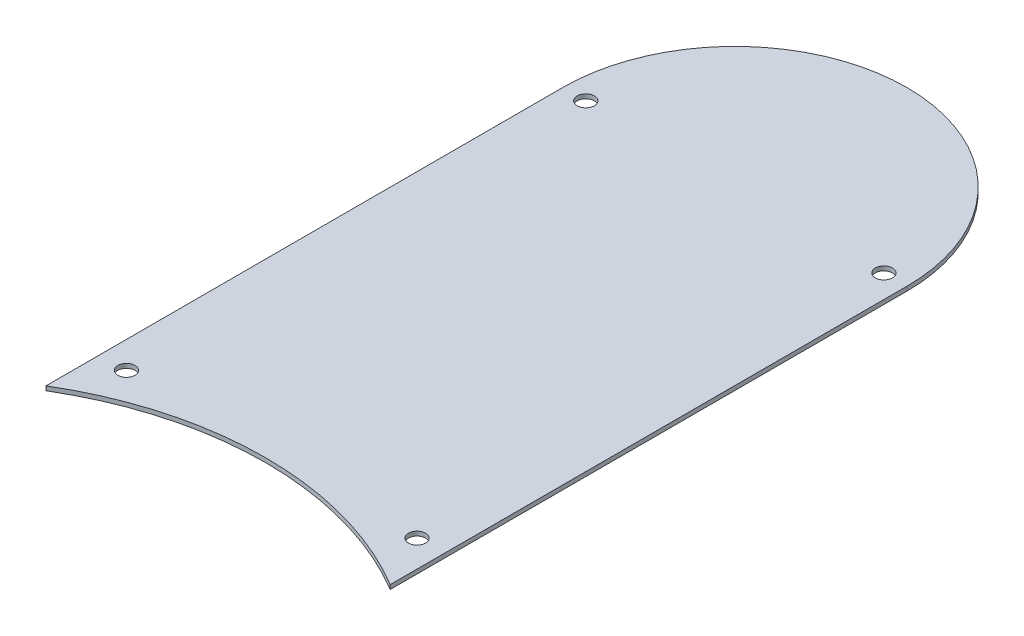
ISO-10303-21;
HEADER;
FILE_DESCRIPTION(('STEP AP214'),'2;1');
FILE_NAME('part.step','',(''),(''),'','','');
FILE_SCHEMA(('AUTOMOTIVE_DESIGN { 1 0 10303 214 1 1 1 1 }'));
ENDSEC;
DATA;
#1=APPLICATION_CONTEXT('core data for automotive mechanical design processes');
#2=APPLICATION_PROTOCOL_DEFINITION('international standard','automotive_design',2000,#1);
#3=PRODUCT_CONTEXT('',#1,'mechanical');
#4=PRODUCT('Part','Part','',(#3));
#5=PRODUCT_RELATED_PRODUCT_CATEGORY('part','',(#4));
#6=PRODUCT_DEFINITION_FORMATION('','',#4);
#7=PRODUCT_DEFINITION_CONTEXT('part definition',#1,'design');
#8=PRODUCT_DEFINITION('design','',#6,#7);
#9=PRODUCT_DEFINITION_SHAPE('','',#8);
#10=(LENGTH_UNIT() NAMED_UNIT(*) SI_UNIT(.MILLI.,.METRE.));
#11=(NAMED_UNIT(*) PLANE_ANGLE_UNIT() SI_UNIT($,.RADIAN.));
#12=(NAMED_UNIT(*) SI_UNIT($,.STERADIAN.) SOLID_ANGLE_UNIT());
#13=UNCERTAINTY_MEASURE_WITH_UNIT(LENGTH_MEASURE(1.E-05),#10,'distance_accuracy_value','');
#14=(GEOMETRIC_REPRESENTATION_CONTEXT(3) GLOBAL_UNCERTAINTY_ASSIGNED_CONTEXT((#13)) GLOBAL_UNIT_ASSIGNED_CONTEXT((#10,
#11,#12)) REPRESENTATION_CONTEXT('',''));
#15=CARTESIAN_POINT('',(0.,0.,0.));
#16=DIRECTION('',(0.,0.,1.));
#17=DIRECTION('',(1.,0.,0.));
#18=AXIS2_PLACEMENT_3D('',#15,#16,#17);
#19=CARTESIAN_POINT('',(0.,0.8,-48.031251596652));
#20=DIRECTION('',(0.,-1.,0.));
#21=DIRECTION('',(0.,0.,1.));
#22=AXIS2_PLACEMENT_3D('',#19,#20,#21);
#23=CYLINDRICAL_SURFACE('',#22,32.0985931710259);
#24=CARTESIAN_POINT('',(0.,0.,-48.031251596652));
#25=DIRECTION('',(0.,-1.,0.));
#26=DIRECTION('',(0.,0.,-1.));
#27=AXIS2_PLACEMENT_3D('',#24,#25,#26);
#28=CIRCLE('',#27,32.0985931710259);
#29=CARTESIAN_POINT('',(-32.098593171028,0.,-48.0312515966533));
#30=VERTEX_POINT('',#29);
#31=CARTESIAN_POINT('',(32.0985931710239,0.,-48.031251596652));
#32=VERTEX_POINT('',#31);
#33=EDGE_CURVE('E107',#30,#32,#28,.T.);
#34=ORIENTED_EDGE('',*,*,#33,.F.);
#35=DIRECTION('',(0.,-1.,0.));
#36=VECTOR('',#35,1.);
#37=CARTESIAN_POINT('',(-32.098593171028,0.8,-48.0312515966533));
#38=LINE('',#37,#36);
#39=CARTESIAN_POINT('',(-32.098593171028,0.8,-48.0312515966533));
#40=VERTEX_POINT('',#39);
#41=EDGE_CURVE('E106',#40,#30,#38,.T.);
#42=ORIENTED_EDGE('',*,*,#41,.F.);
#43=CARTESIAN_POINT('',(0.,0.8,-48.031251596652));
#44=DIRECTION('',(0.,-1.,0.));
#45=DIRECTION('',(0.,0.,-1.));
#46=AXIS2_PLACEMENT_3D('',#43,#44,#45);
#47=CIRCLE('',#46,32.0985931710259);
#48=CARTESIAN_POINT('',(32.0985931710239,0.8,-48.031251596652));
#49=VERTEX_POINT('',#48);
#50=EDGE_CURVE('E100',#40,#49,#47,.T.);
#51=ORIENTED_EDGE('',*,*,#50,.T.);
#52=DIRECTION('',(0.,-1.,0.));
#53=VECTOR('',#52,1.);
#54=CARTESIAN_POINT('',(32.0985931710239,0.8,-48.031251596652));
#55=LINE('',#54,#53);
#56=EDGE_CURVE('E11',#49,#32,#55,.T.);
#57=ORIENTED_EDGE('',*,*,#56,.T.);
#58=EDGE_LOOP('',(#34,#42,#51,#57));
#59=FACE_BOUND('',#58,.T.);
#60=ADVANCED_FACE('F43',(#59),#23,.T.);
#61=CARTESIAN_POINT('',(32.0985931710239,0.8,-48.031251596652));
#62=DIRECTION('',(-1.,0.,0.));
#63=DIRECTION('',(0.,0.,-1.));
#64=AXIS2_PLACEMENT_3D('',#61,#62,#63);
#65=PLANE('',#64);
#66=DIRECTION('',(0.,0.,1.));
#67=VECTOR('',#66,1.);
#68=CARTESIAN_POINT('',(32.0985931710239,0.,-48.031251596652));
#69=LINE('',#68,#67);
#70=CARTESIAN_POINT('',(32.0985931710239,0.,48.3410473856784));
#71=VERTEX_POINT('',#70);
#72=EDGE_CURVE('E109',#32,#71,#69,.T.);
#73=ORIENTED_EDGE('',*,*,#72,.F.);
#74=ORIENTED_EDGE('',*,*,#56,.F.);
#75=DIRECTION('',(0.,0.,1.));
#76=VECTOR('',#75,1.);
#77=CARTESIAN_POINT('',(32.0985931710239,0.8,-48.031251596652));
#78=LINE('',#77,#76);
#79=CARTESIAN_POINT('',(32.0985931710239,0.8,48.3410473856784));
#80=VERTEX_POINT('',#79);
#81=EDGE_CURVE('E84',#49,#80,#78,.T.);
#82=ORIENTED_EDGE('',*,*,#81,.T.);
#83=DIRECTION('',(0.,-1.,0.));
#84=VECTOR('',#83,1.);
#85=CARTESIAN_POINT('',(32.0985931710239,0.8,48.3410473856784));
#86=LINE('',#85,#84);
#87=EDGE_CURVE('E51',#80,#71,#86,.T.);
#88=ORIENTED_EDGE('',*,*,#87,.T.);
#89=EDGE_LOOP('',(#73,#74,#82,#88));
#90=FACE_BOUND('',#89,.T.);
#91=ADVANCED_FACE('F98',(#90),#65,.F.);
#92=CARTESIAN_POINT('',(-3.68743095678564E-12,0.8,101.968748403349));
#93=DIRECTION('',(0.,-1.,0.));
#94=DIRECTION('',(0.,0.,1.));
#95=AXIS2_PLACEMENT_3D('',#92,#93,#94);
#96=CYLINDRICAL_SURFACE('',#95,62.4999999999987);
#97=CARTESIAN_POINT('',(-3.68743095678564E-12,0.,101.968748403349));
#98=DIRECTION('',(0.,1.,0.));
#99=DIRECTION('',(0.,0.,-1.));
#100=AXIS2_PLACEMENT_3D('',#97,#98,#99);
#101=CIRCLE('',#100,62.4999999999987);
#102=CARTESIAN_POINT('',(-32.098593171028,0.,48.3410473856765));
#103=VERTEX_POINT('',#102);
#104=EDGE_CURVE('E94',#71,#103,#101,.T.);
#105=ORIENTED_EDGE('',*,*,#104,.F.);
#106=ORIENTED_EDGE('',*,*,#87,.F.);
#107=CARTESIAN_POINT('',(-3.68743095678564E-12,0.8,101.968748403349));
#108=DIRECTION('',(0.,1.,0.));
#109=DIRECTION('',(0.,0.,-1.));
#110=AXIS2_PLACEMENT_3D('',#107,#108,#109);
#111=CIRCLE('',#110,62.4999999999987);
#112=CARTESIAN_POINT('',(-32.098593171028,0.8,48.3410473856765));
#113=VERTEX_POINT('',#112);
#114=EDGE_CURVE('E87',#80,#113,#111,.T.);
#115=ORIENTED_EDGE('',*,*,#114,.T.);
#116=DIRECTION('',(0.,-1.,0.));
#117=VECTOR('',#116,1.);
#118=CARTESIAN_POINT('',(-32.098593171028,0.8,48.3410473856765));
#119=LINE('',#118,#117);
#120=EDGE_CURVE('E97',#113,#103,#119,.T.);
#121=ORIENTED_EDGE('',*,*,#120,.T.);
#122=EDGE_LOOP('',(#105,#106,#115,#121));
#123=FACE_BOUND('',#122,.T.);
#124=ADVANCED_FACE('F93',(#123),#96,.F.);
#125=CARTESIAN_POINT('',(-32.098593171028,0.8,-48.0312515966533));
#126=DIRECTION('',(1.,0.,0.));
#127=DIRECTION('',(0.,0.,1.));
#128=AXIS2_PLACEMENT_3D('',#125,#126,#127);
#129=PLANE('',#128);
#130=DIRECTION('',(0.,0.,-1.));
#131=VECTOR('',#130,1.);
#132=CARTESIAN_POINT('',(-32.098593171028,0.,-48.0312515966533));
#133=LINE('',#132,#131);
#134=EDGE_CURVE('E73',#103,#30,#133,.T.);
#135=ORIENTED_EDGE('',*,*,#134,.F.);
#136=ORIENTED_EDGE('',*,*,#120,.F.);
#137=DIRECTION('',(0.,0.,-1.));
#138=VECTOR('',#137,1.);
#139=CARTESIAN_POINT('',(-32.098593171028,0.8,-48.0312515966533));
#140=LINE('',#139,#138);
#141=EDGE_CURVE('E59',#113,#40,#140,.T.);
#142=ORIENTED_EDGE('',*,*,#141,.T.);
#143=ORIENTED_EDGE('',*,*,#41,.T.);
#144=EDGE_LOOP('',(#135,#136,#142,#143));
#145=FACE_BOUND('',#144,.T.);
#146=ADVANCED_FACE('F119',(#145),#129,.F.);
#147=CARTESIAN_POINT('',(0.,0.8,-48.031251596652));
#148=DIRECTION('',(0.,1.,0.));
#149=DIRECTION('',(0.,0.,-1.));
#150=AXIS2_PLACEMENT_3D('',#147,#148,#149);
#151=PLANE('',#150);
#152=CARTESIAN_POINT('',(-27.7992965855186,0.8,-48.031251596652));
#153=DIRECTION('',(0.,1.,0.));
#154=DIRECTION('',(0.,0.,1.));
#155=AXIS2_PLACEMENT_3D('',#152,#153,#154);
#156=CIRCLE('',#155,1.6000000000015);
#157=CARTESIAN_POINT('',(-27.7992965855186,0.8,-46.4312515966505));
#158=VERTEX_POINT('',#157);
#159=EDGE_CURVE('E207',#158,#158,#156,.T.);
#160=ORIENTED_EDGE('',*,*,#159,.F.);
#161=EDGE_LOOP('',(#160));
#162=FACE_BOUND('',#161,.T.);
#163=CARTESIAN_POINT('',(27.0985931710258,0.8,38.341047385677));
#164=DIRECTION('',(0.,1.,0.));
#165=DIRECTION('',(0.,0.,1.));
#166=AXIS2_PLACEMENT_3D('',#163,#164,#165);
#167=CIRCLE('',#166,1.60000000000002);
#168=CARTESIAN_POINT('',(27.0985931710258,0.8,39.941047385677));
#169=VERTEX_POINT('',#168);
#170=EDGE_CURVE('E222',#169,#169,#167,.T.);
#171=ORIENTED_EDGE('',*,*,#170,.F.);
#172=EDGE_LOOP('',(#171));
#173=FACE_BOUND('',#172,.T.);
#174=CARTESIAN_POINT('',(-27.0985931710315,0.8,38.3410473856769));
#175=DIRECTION('',(0.,1.,0.));
#176=DIRECTION('',(0.,0.,1.));
#177=AXIS2_PLACEMENT_3D('',#174,#175,#176);
#178=CIRCLE('',#177,1.60000000000007);
#179=CARTESIAN_POINT('',(-27.0985931710315,0.8,39.941047385677));
#180=VERTEX_POINT('',#179);
#181=EDGE_CURVE('E217',#180,#180,#178,.T.);
#182=ORIENTED_EDGE('',*,*,#181,.F.);
#183=EDGE_LOOP('',(#182));
#184=FACE_BOUND('',#183,.T.);
#185=CARTESIAN_POINT('',(27.7992965855129,0.8,-48.031251596652));
#186=DIRECTION('',(0.,1.,0.));
#187=DIRECTION('',(0.,0.,1.));
#188=AXIS2_PLACEMENT_3D('',#185,#186,#187);
#189=CIRCLE('',#188,1.60000000000059);
#190=CARTESIAN_POINT('',(27.7992965855129,0.8,-46.4312515966514));
#191=VERTEX_POINT('',#190);
#192=EDGE_CURVE('E110',#191,#191,#189,.T.);
#193=ORIENTED_EDGE('',*,*,#192,.F.);
#194=EDGE_LOOP('',(#193));
#195=FACE_BOUND('',#194,.T.);
#196=ORIENTED_EDGE('',*,*,#50,.F.);
#197=ORIENTED_EDGE('',*,*,#141,.F.);
#198=ORIENTED_EDGE('',*,*,#114,.F.);
#199=ORIENTED_EDGE('',*,*,#81,.F.);
#200=EDGE_LOOP('',(#196,#197,#198,#199));
#201=FACE_BOUND('',#200,.T.);
#202=ADVANCED_FACE('F89',(#162,#173,#184,#195,#201),#151,.T.);
#203=CARTESIAN_POINT('',(0.,0.,-48.031251596652));
#204=DIRECTION('',(0.,1.,0.));
#205=DIRECTION('',(0.,0.,-1.));
#206=AXIS2_PLACEMENT_3D('',#203,#204,#205);
#207=PLANE('',#206);
#208=CARTESIAN_POINT('',(-27.7992965855186,0.,-48.031251596652));
#209=DIRECTION('',(0.,1.,0.));
#210=DIRECTION('',(0.,0.,1.));
#211=AXIS2_PLACEMENT_3D('',#208,#209,#210);
#212=CIRCLE('',#211,1.6000000000015);
#213=CARTESIAN_POINT('',(-27.7992965855186,0.,-46.4312515966505));
#214=VERTEX_POINT('',#213);
#215=EDGE_CURVE('E210',#214,#214,#212,.T.);
#216=ORIENTED_EDGE('',*,*,#215,.T.);
#217=EDGE_LOOP('',(#216));
#218=FACE_BOUND('',#217,.T.);
#219=CARTESIAN_POINT('',(27.0985931710258,0.,38.341047385677));
#220=DIRECTION('',(0.,1.,0.));
#221=DIRECTION('',(0.,0.,1.));
#222=AXIS2_PLACEMENT_3D('',#219,#220,#221);
#223=CIRCLE('',#222,1.60000000000002);
#224=CARTESIAN_POINT('',(27.0985931710258,0.,39.941047385677));
#225=VERTEX_POINT('',#224);
#226=EDGE_CURVE('E214',#225,#225,#223,.T.);
#227=ORIENTED_EDGE('',*,*,#226,.T.);
#228=EDGE_LOOP('',(#227));
#229=FACE_BOUND('',#228,.T.);
#230=CARTESIAN_POINT('',(-27.0985931710315,0.,38.3410473856769));
#231=DIRECTION('',(0.,1.,0.));
#232=DIRECTION('',(0.,0.,1.));
#233=AXIS2_PLACEMENT_3D('',#230,#231,#232);
#234=CIRCLE('',#233,1.60000000000007);
#235=CARTESIAN_POINT('',(-27.0985931710315,0.,39.941047385677));
#236=VERTEX_POINT('',#235);
#237=EDGE_CURVE('E225',#236,#236,#234,.T.);
#238=ORIENTED_EDGE('',*,*,#237,.T.);
#239=EDGE_LOOP('',(#238));
#240=FACE_BOUND('',#239,.T.);
#241=CARTESIAN_POINT('',(27.7992965855129,0.,-48.031251596652));
#242=DIRECTION('',(0.,1.,0.));
#243=DIRECTION('',(0.,0.,1.));
#244=AXIS2_PLACEMENT_3D('',#241,#242,#243);
#245=CIRCLE('',#244,1.60000000000059);
#246=CARTESIAN_POINT('',(27.7992965855129,0.,-46.4312515966514));
#247=VERTEX_POINT('',#246);
#248=EDGE_CURVE('E211',#247,#247,#245,.T.);
#249=ORIENTED_EDGE('',*,*,#248,.T.);
#250=EDGE_LOOP('',(#249));
#251=FACE_BOUND('',#250,.T.);
#252=ORIENTED_EDGE('',*,*,#33,.T.);
#253=ORIENTED_EDGE('',*,*,#72,.T.);
#254=ORIENTED_EDGE('',*,*,#104,.T.);
#255=ORIENTED_EDGE('',*,*,#134,.T.);
#256=EDGE_LOOP('',(#252,#253,#254,#255));
#257=FACE_BOUND('',#256,.T.);
#258=ADVANCED_FACE('F115',(#218,#229,#240,#251,#257),#207,.F.);
#259=CARTESIAN_POINT('',(27.7992965855129,0.8,-48.031251596652));
#260=DIRECTION('',(0.,-1.,0.));
#261=DIRECTION('',(0.,0.,1.));
#262=AXIS2_PLACEMENT_3D('',#259,#260,#261);
#263=CYLINDRICAL_SURFACE('',#262,1.60000000000059);
#264=ORIENTED_EDGE('',*,*,#192,.T.);
#265=EDGE_LOOP('',(#264));
#266=FACE_BOUND('',#265,.T.);
#267=ORIENTED_EDGE('',*,*,#248,.F.);
#268=EDGE_LOOP('',(#267));
#269=FACE_BOUND('',#268,.T.);
#270=ADVANCED_FACE('F162',(#266,#269),#263,.F.);
#271=CARTESIAN_POINT('',(-27.0985931710315,0.8,38.3410473856769));
#272=DIRECTION('',(0.,-1.,0.));
#273=DIRECTION('',(0.,0.,1.));
#274=AXIS2_PLACEMENT_3D('',#271,#272,#273);
#275=CYLINDRICAL_SURFACE('',#274,1.60000000000007);
#276=ORIENTED_EDGE('',*,*,#181,.T.);
#277=EDGE_LOOP('',(#276));
#278=FACE_BOUND('',#277,.T.);
#279=ORIENTED_EDGE('',*,*,#237,.F.);
#280=EDGE_LOOP('',(#279));
#281=FACE_BOUND('',#280,.T.);
#282=ADVANCED_FACE('F171',(#278,#281),#275,.F.);
#283=CARTESIAN_POINT('',(27.0985931710258,0.8,38.341047385677));
#284=DIRECTION('',(0.,-1.,0.));
#285=DIRECTION('',(0.,0.,1.));
#286=AXIS2_PLACEMENT_3D('',#283,#284,#285);
#287=CYLINDRICAL_SURFACE('',#286,1.60000000000002);
#288=ORIENTED_EDGE('',*,*,#170,.T.);
#289=EDGE_LOOP('',(#288));
#290=FACE_BOUND('',#289,.T.);
#291=ORIENTED_EDGE('',*,*,#226,.F.);
#292=EDGE_LOOP('',(#291));
#293=FACE_BOUND('',#292,.T.);
#294=ADVANCED_FACE('F181',(#290,#293),#287,.F.);
#295=CARTESIAN_POINT('',(-27.7992965855186,0.8,-48.031251596652));
#296=DIRECTION('',(0.,-1.,0.));
#297=DIRECTION('',(0.,0.,1.));
#298=AXIS2_PLACEMENT_3D('',#295,#296,#297);
#299=CYLINDRICAL_SURFACE('',#298,1.6000000000015);
#300=ORIENTED_EDGE('',*,*,#159,.T.);
#301=EDGE_LOOP('',(#300));
#302=FACE_BOUND('',#301,.T.);
#303=ORIENTED_EDGE('',*,*,#215,.F.);
#304=EDGE_LOOP('',(#303));
#305=FACE_BOUND('',#304,.T.);
#306=ADVANCED_FACE('F191',(#302,#305),#299,.F.);
#307=CLOSED_SHELL('',(#60,#91,#124,#146,#202,#258,#270,#282,#294,#306));
#308=MANIFOLD_SOLID_BREP('B2',#307);
#309=ADVANCED_BREP_SHAPE_REPRESENTATION('',(#18,#308),#14);
#310=SHAPE_DEFINITION_REPRESENTATION(#9,#309);
ENDSEC;
END-ISO-10303-21;
